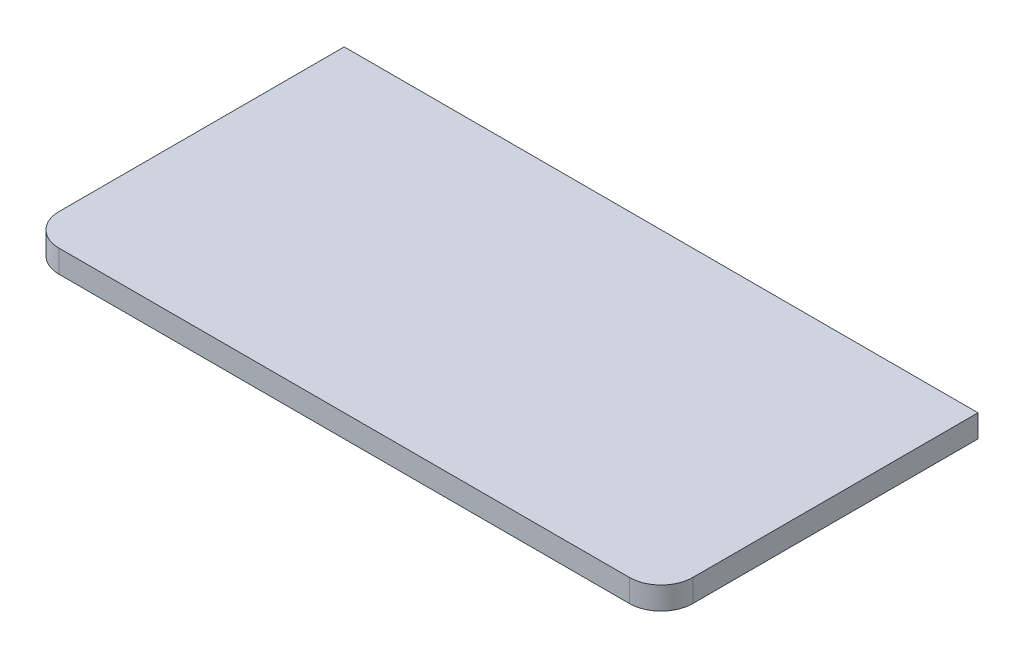
ISO-10303-21;
HEADER;
FILE_DESCRIPTION(('STEP AP214'),'2;1');
FILE_NAME('part.step','',(''),(''),'','','');
FILE_SCHEMA(('AUTOMOTIVE_DESIGN { 1 0 10303 214 1 1 1 1 }'));
ENDSEC;
DATA;
#1=APPLICATION_CONTEXT('core data for automotive mechanical design processes');
#2=APPLICATION_PROTOCOL_DEFINITION('international standard','automotive_design',2000,#1);
#3=PRODUCT_CONTEXT('',#1,'mechanical');
#4=PRODUCT('Part','Part','',(#3));
#5=PRODUCT_RELATED_PRODUCT_CATEGORY('part','',(#4));
#6=PRODUCT_DEFINITION_FORMATION('','',#4);
#7=PRODUCT_DEFINITION_CONTEXT('part definition',#1,'design');
#8=PRODUCT_DEFINITION('design','',#6,#7);
#9=PRODUCT_DEFINITION_SHAPE('','',#8);
#10=(LENGTH_UNIT() NAMED_UNIT(*) SI_UNIT(.MILLI.,.METRE.));
#11=(NAMED_UNIT(*) PLANE_ANGLE_UNIT() SI_UNIT($,.RADIAN.));
#12=(NAMED_UNIT(*) SI_UNIT($,.STERADIAN.) SOLID_ANGLE_UNIT());
#13=UNCERTAINTY_MEASURE_WITH_UNIT(LENGTH_MEASURE(1.E-05),#10,'distance_accuracy_value','');
#14=(GEOMETRIC_REPRESENTATION_CONTEXT(3) GLOBAL_UNCERTAINTY_ASSIGNED_CONTEXT((#13)) GLOBAL_UNIT_ASSIGNED_CONTEXT((#10,
#11,#12)) REPRESENTATION_CONTEXT('',''));
#15=CARTESIAN_POINT('',(0.,0.,0.));
#16=DIRECTION('',(0.,0.,1.));
#17=DIRECTION('',(1.,0.,0.));
#18=AXIS2_PLACEMENT_3D('',#15,#16,#17);
#19=CARTESIAN_POINT('',(140.,10.,70.));
#20=DIRECTION('',(-1.,0.,0.));
#21=DIRECTION('',(0.,0.,1.));
#22=AXIS2_PLACEMENT_3D('',#19,#20,#21);
#23=PLANE('',#22);
#24=DIRECTION('',(0.,0.,-1.));
#25=VECTOR('',#24,1.);
#26=CARTESIAN_POINT('',(140.,10.,70.));
#27=LINE('',#26,#25);
#28=CARTESIAN_POINT('',(140.,10.,56.));
#29=VERTEX_POINT('',#28);
#30=CARTESIAN_POINT('',(140.,10.,-70.));
#31=VERTEX_POINT('',#30);
#32=EDGE_CURVE('E88',#29,#31,#27,.T.);
#33=ORIENTED_EDGE('',*,*,#32,.F.);
#34=DIRECTION('',(0.,-1.,0.));
#35=VECTOR('',#34,1.);
#36=CARTESIAN_POINT('',(140.,10.,56.));
#37=LINE('',#36,#35);
#38=CARTESIAN_POINT('',(140.,0.,56.));
#39=VERTEX_POINT('',#38);
#40=EDGE_CURVE('E111',#29,#39,#37,.T.);
#41=ORIENTED_EDGE('',*,*,#40,.T.);
#42=DIRECTION('',(0.,0.,-1.));
#43=VECTOR('',#42,1.);
#44=CARTESIAN_POINT('',(140.,0.,70.));
#45=LINE('',#44,#43);
#46=CARTESIAN_POINT('',(140.,0.,-70.));
#47=VERTEX_POINT('',#46);
#48=EDGE_CURVE('E109',#39,#47,#45,.T.);
#49=ORIENTED_EDGE('',*,*,#48,.T.);
#50=DIRECTION('',(0.,-1.,0.));
#51=VECTOR('',#50,1.);
#52=CARTESIAN_POINT('',(140.,10.,-70.));
#53=LINE('',#52,#51);
#54=EDGE_CURVE('E103',#31,#47,#53,.T.);
#55=ORIENTED_EDGE('',*,*,#54,.F.);
#56=EDGE_LOOP('',(#33,#41,#49,#55));
#57=FACE_BOUND('',#56,.T.);
#58=ADVANCED_FACE('F34',(#57),#23,.F.);
#59=CARTESIAN_POINT('',(-140.,10.,-70.));
#60=DIRECTION('',(0.,0.,1.));
#61=DIRECTION('',(1.,0.,0.));
#62=AXIS2_PLACEMENT_3D('',#59,#60,#61);
#63=PLANE('',#62);
#64=DIRECTION('',(-1.,0.,0.));
#65=VECTOR('',#64,1.);
#66=CARTESIAN_POINT('',(-140.,0.,-70.));
#67=LINE('',#66,#65);
#68=CARTESIAN_POINT('',(-140.,0.,-70.));
#69=VERTEX_POINT('',#68);
#70=EDGE_CURVE('E138',#47,#69,#67,.T.);
#71=ORIENTED_EDGE('',*,*,#70,.T.);
#72=DIRECTION('',(0.,-1.,0.));
#73=VECTOR('',#72,1.);
#74=CARTESIAN_POINT('',(-140.,10.,-70.));
#75=LINE('',#74,#73);
#76=CARTESIAN_POINT('',(-140.,10.,-70.));
#77=VERTEX_POINT('',#76);
#78=EDGE_CURVE('E105',#77,#69,#75,.T.);
#79=ORIENTED_EDGE('',*,*,#78,.F.);
#80=DIRECTION('',(-1.,0.,0.));
#81=VECTOR('',#80,1.);
#82=CARTESIAN_POINT('',(-140.,10.,-70.));
#83=LINE('',#82,#81);
#84=EDGE_CURVE('E91',#31,#77,#83,.T.);
#85=ORIENTED_EDGE('',*,*,#84,.F.);
#86=ORIENTED_EDGE('',*,*,#54,.T.);
#87=EDGE_LOOP('',(#71,#79,#85,#86));
#88=FACE_BOUND('',#87,.T.);
#89=ADVANCED_FACE('F102',(#88),#63,.F.);
#90=CARTESIAN_POINT('',(-140.,10.,70.));
#91=DIRECTION('',(1.,0.,0.));
#92=DIRECTION('',(0.,0.,-1.));
#93=AXIS2_PLACEMENT_3D('',#90,#91,#92);
#94=PLANE('',#93);
#95=DIRECTION('',(0.,0.,1.));
#96=VECTOR('',#95,1.);
#97=CARTESIAN_POINT('',(-140.,0.,70.));
#98=LINE('',#97,#96);
#99=CARTESIAN_POINT('',(-140.,0.,56.));
#100=VERTEX_POINT('',#99);
#101=EDGE_CURVE('E136',#69,#100,#98,.T.);
#102=ORIENTED_EDGE('',*,*,#101,.T.);
#103=DIRECTION('',(0.,-1.,0.));
#104=VECTOR('',#103,1.);
#105=CARTESIAN_POINT('',(-140.,10.,56.));
#106=LINE('',#105,#104);
#107=CARTESIAN_POINT('',(-140.,10.,56.));
#108=VERTEX_POINT('',#107);
#109=EDGE_CURVE('E11',#100,#108,#106,.F.);
#110=ORIENTED_EDGE('',*,*,#109,.T.);
#111=DIRECTION('',(0.,0.,1.));
#112=VECTOR('',#111,1.);
#113=CARTESIAN_POINT('',(-140.,10.,70.));
#114=LINE('',#113,#112);
#115=EDGE_CURVE('E106',#77,#108,#114,.T.);
#116=ORIENTED_EDGE('',*,*,#115,.F.);
#117=ORIENTED_EDGE('',*,*,#78,.T.);
#118=EDGE_LOOP('',(#102,#110,#116,#117));
#119=FACE_BOUND('',#118,.T.);
#120=ADVANCED_FACE('F137',(#119),#94,.F.);
#121=CARTESIAN_POINT('',(-140.,10.,70.));
#122=DIRECTION('',(0.,0.,-1.));
#123=DIRECTION('',(-1.,0.,0.));
#124=AXIS2_PLACEMENT_3D('',#121,#122,#123);
#125=PLANE('',#124);
#126=DIRECTION('',(1.,0.,0.));
#127=VECTOR('',#126,1.);
#128=CARTESIAN_POINT('',(-140.,0.,70.));
#129=LINE('',#128,#127);
#130=CARTESIAN_POINT('',(-126.,0.,70.));
#131=VERTEX_POINT('',#130);
#132=CARTESIAN_POINT('',(126.,0.,70.));
#133=VERTEX_POINT('',#132);
#134=EDGE_CURVE('E98',#131,#133,#129,.T.);
#135=ORIENTED_EDGE('',*,*,#134,.T.);
#136=DIRECTION('',(0.,-1.,0.));
#137=VECTOR('',#136,1.);
#138=CARTESIAN_POINT('',(126.,10.,70.));
#139=LINE('',#138,#137);
#140=CARTESIAN_POINT('',(126.,10.,70.));
#141=VERTEX_POINT('',#140);
#142=EDGE_CURVE('E55',#133,#141,#139,.F.);
#143=ORIENTED_EDGE('',*,*,#142,.T.);
#144=DIRECTION('',(1.,0.,0.));
#145=VECTOR('',#144,1.);
#146=CARTESIAN_POINT('',(-140.,10.,70.));
#147=LINE('',#146,#145);
#148=CARTESIAN_POINT('',(-126.,10.,70.));
#149=VERTEX_POINT('',#148);
#150=EDGE_CURVE('E115',#149,#141,#147,.T.);
#151=ORIENTED_EDGE('',*,*,#150,.F.);
#152=DIRECTION('',(0.,-1.,0.));
#153=VECTOR('',#152,1.);
#154=CARTESIAN_POINT('',(-126.,10.,70.));
#155=LINE('',#154,#153);
#156=EDGE_CURVE('E122',#149,#131,#155,.T.);
#157=ORIENTED_EDGE('',*,*,#156,.T.);
#158=EDGE_LOOP('',(#135,#143,#151,#157));
#159=FACE_BOUND('',#158,.T.);
#160=ADVANCED_FACE('F130',(#159),#125,.F.);
#161=CARTESIAN_POINT('',(0.,10.,0.));
#162=DIRECTION('',(0.,-1.,0.));
#163=DIRECTION('',(0.,0.,-1.));
#164=AXIS2_PLACEMENT_3D('',#161,#162,#163);
#165=PLANE('',#164);
#166=ORIENTED_EDGE('',*,*,#150,.T.);
#167=CARTESIAN_POINT('',(126.,10.,56.));
#168=DIRECTION('',(0.,-1.,0.));
#169=DIRECTION('',(0.,0.,-1.));
#170=AXIS2_PLACEMENT_3D('',#167,#168,#169);
#171=CIRCLE('',#170,14.);
#172=EDGE_CURVE('E42',#141,#29,#171,.F.);
#173=ORIENTED_EDGE('',*,*,#172,.T.);
#174=ORIENTED_EDGE('',*,*,#32,.T.);
#175=ORIENTED_EDGE('',*,*,#84,.T.);
#176=ORIENTED_EDGE('',*,*,#115,.T.);
#177=CARTESIAN_POINT('',(-126.,10.,56.));
#178=DIRECTION('',(0.,-1.,0.));
#179=DIRECTION('',(0.,0.,-1.));
#180=AXIS2_PLACEMENT_3D('',#177,#178,#179);
#181=CIRCLE('',#180,14.);
#182=EDGE_CURVE('E126',#108,#149,#181,.F.);
#183=ORIENTED_EDGE('',*,*,#182,.T.);
#184=EDGE_LOOP('',(#166,#173,#174,#175,#176,#183));
#185=FACE_BOUND('',#184,.T.);
#186=ADVANCED_FACE('F90',(#185),#165,.F.);
#187=CARTESIAN_POINT('',(0.,0.,0.));
#188=DIRECTION('',(0.,-1.,0.));
#189=DIRECTION('',(0.,0.,-1.));
#190=AXIS2_PLACEMENT_3D('',#187,#188,#189);
#191=PLANE('',#190);
#192=ORIENTED_EDGE('',*,*,#48,.F.);
#193=CARTESIAN_POINT('',(126.,0.,56.));
#194=DIRECTION('',(0.,-1.,0.));
#195=DIRECTION('',(0.,0.,-1.));
#196=AXIS2_PLACEMENT_3D('',#193,#194,#195);
#197=CIRCLE('',#196,14.);
#198=EDGE_CURVE('E120',#39,#133,#197,.T.);
#199=ORIENTED_EDGE('',*,*,#198,.T.);
#200=ORIENTED_EDGE('',*,*,#134,.F.);
#201=CARTESIAN_POINT('',(-126.,0.,56.));
#202=DIRECTION('',(0.,-1.,0.));
#203=DIRECTION('',(0.,0.,-1.));
#204=AXIS2_PLACEMENT_3D('',#201,#202,#203);
#205=CIRCLE('',#204,14.);
#206=EDGE_CURVE('E113',#131,#100,#205,.T.);
#207=ORIENTED_EDGE('',*,*,#206,.T.);
#208=ORIENTED_EDGE('',*,*,#101,.F.);
#209=ORIENTED_EDGE('',*,*,#70,.F.);
#210=EDGE_LOOP('',(#192,#199,#200,#207,#208,#209));
#211=FACE_BOUND('',#210,.T.);
#212=ADVANCED_FACE('F135',(#211),#191,.T.);
#213=CARTESIAN_POINT('',(126.,10.,56.));
#214=DIRECTION('',(0.,-1.,0.));
#215=DIRECTION('',(0.,0.,-1.));
#216=AXIS2_PLACEMENT_3D('',#213,#214,#215);
#217=CYLINDRICAL_SURFACE('',#216,14.);
#218=ORIENTED_EDGE('',*,*,#172,.F.);
#219=ORIENTED_EDGE('',*,*,#142,.F.);
#220=ORIENTED_EDGE('',*,*,#198,.F.);
#221=ORIENTED_EDGE('',*,*,#40,.F.);
#222=EDGE_LOOP('',(#218,#219,#220,#221));
#223=FACE_BOUND('',#222,.T.);
#224=ADVANCED_FACE('F144',(#223),#217,.T.);
#225=CARTESIAN_POINT('',(-126.,10.,56.));
#226=DIRECTION('',(0.,-1.,0.));
#227=DIRECTION('',(0.,0.,-1.));
#228=AXIS2_PLACEMENT_3D('',#225,#226,#227);
#229=CYLINDRICAL_SURFACE('',#228,14.);
#230=ORIENTED_EDGE('',*,*,#182,.F.);
#231=ORIENTED_EDGE('',*,*,#109,.F.);
#232=ORIENTED_EDGE('',*,*,#206,.F.);
#233=ORIENTED_EDGE('',*,*,#156,.F.);
#234=EDGE_LOOP('',(#230,#231,#232,#233));
#235=FACE_BOUND('',#234,.T.);
#236=ADVANCED_FACE('F36',(#235),#229,.T.);
#237=CLOSED_SHELL('',(#58,#89,#120,#160,#186,#212,#224,#236));
#238=MANIFOLD_SOLID_BREP('B2',#237);
#239=ADVANCED_BREP_SHAPE_REPRESENTATION('',(#18,#238),#14);
#240=SHAPE_DEFINITION_REPRESENTATION(#9,#239);
ENDSEC;
END-ISO-10303-21;
